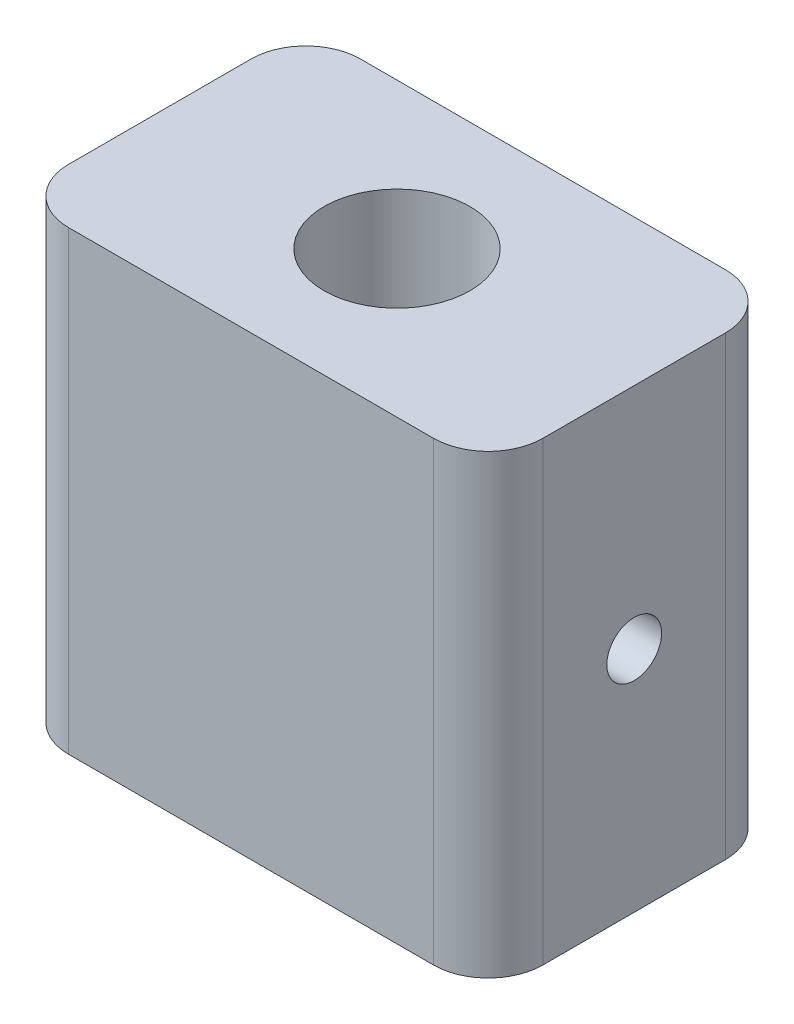
ISO-10303-21;
HEADER;
FILE_DESCRIPTION(('STEP AP214'),'2;1');
FILE_NAME('part.step','',(''),(''),'','','');
FILE_SCHEMA(('AUTOMOTIVE_DESIGN { 1 0 10303 214 1 1 1 1 }'));
ENDSEC;
DATA;
#1=APPLICATION_CONTEXT('core data for automotive mechanical design processes');
#2=APPLICATION_PROTOCOL_DEFINITION('international standard','automotive_design',2000,#1);
#3=PRODUCT_CONTEXT('',#1,'mechanical');
#4=PRODUCT('Part','Part','',(#3));
#5=PRODUCT_RELATED_PRODUCT_CATEGORY('part','',(#4));
#6=PRODUCT_DEFINITION_FORMATION('','',#4);
#7=PRODUCT_DEFINITION_CONTEXT('part definition',#1,'design');
#8=PRODUCT_DEFINITION('design','',#6,#7);
#9=PRODUCT_DEFINITION_SHAPE('','',#8);
#10=(LENGTH_UNIT() NAMED_UNIT(*) SI_UNIT(.MILLI.,.METRE.));
#11=(NAMED_UNIT(*) PLANE_ANGLE_UNIT() SI_UNIT($,.RADIAN.));
#12=(NAMED_UNIT(*) SI_UNIT($,.STERADIAN.) SOLID_ANGLE_UNIT());
#13=UNCERTAINTY_MEASURE_WITH_UNIT(LENGTH_MEASURE(1.E-05),#10,'distance_accuracy_value','');
#14=(GEOMETRIC_REPRESENTATION_CONTEXT(3) GLOBAL_UNCERTAINTY_ASSIGNED_CONTEXT((#13)) GLOBAL_UNIT_ASSIGNED_CONTEXT((#10,
#11,#12)) REPRESENTATION_CONTEXT('',''));
#15=CARTESIAN_POINT('',(0.,0.,0.));
#16=DIRECTION('',(0.,0.,1.));
#17=DIRECTION('',(1.,0.,0.));
#18=AXIS2_PLACEMENT_3D('',#15,#16,#17);
#19=CARTESIAN_POINT('',(-10.,25.,5.));
#20=DIRECTION('',(0.,-1.,0.));
#21=DIRECTION('',(0.,0.,-1.));
#22=AXIS2_PLACEMENT_3D('',#19,#20,#21);
#23=PLANE('',#22);
#24=CARTESIAN_POINT('',(-10.,25.,5.));
#25=DIRECTION('',(0.,1.,0.));
#26=DIRECTION('',(0.,0.,-1.));
#27=AXIS2_PLACEMENT_3D('',#24,#25,#26);
#28=CIRCLE('',#27,3.);
#29=CARTESIAN_POINT('',(-13.,25.,5.));
#30=VERTEX_POINT('',#29);
#31=CARTESIAN_POINT('',(-10.,25.,8.));
#32=VERTEX_POINT('',#31);
#33=EDGE_CURVE('E151',#30,#32,#28,.T.);
#34=ORIENTED_EDGE('',*,*,#33,.T.);
#35=DIRECTION('',(1.,0.,0.));
#36=VECTOR('',#35,1.);
#37=CARTESIAN_POINT('',(10.,25.,8.));
#38=LINE('',#37,#36);
#39=CARTESIAN_POINT('',(10.,25.,8.));
#40=VERTEX_POINT('',#39);
#41=EDGE_CURVE('E99',#32,#40,#38,.T.);
#42=ORIENTED_EDGE('',*,*,#41,.T.);
#43=CARTESIAN_POINT('',(10.,25.,5.));
#44=DIRECTION('',(0.,1.,0.));
#45=DIRECTION('',(0.,0.,1.));
#46=AXIS2_PLACEMENT_3D('',#43,#44,#45);
#47=CIRCLE('',#46,3.);
#48=CARTESIAN_POINT('',(13.,25.,5.));
#49=VERTEX_POINT('',#48);
#50=EDGE_CURVE('E221',#40,#49,#47,.T.);
#51=ORIENTED_EDGE('',*,*,#50,.T.);
#52=DIRECTION('',(0.,0.,-1.));
#53=VECTOR('',#52,1.);
#54=CARTESIAN_POINT('',(13.,25.,5.));
#55=LINE('',#54,#53);
#56=CARTESIAN_POINT('',(13.,25.,-5.));
#57=VERTEX_POINT('',#56);
#58=EDGE_CURVE('E228',#49,#57,#55,.T.);
#59=ORIENTED_EDGE('',*,*,#58,.T.);
#60=CARTESIAN_POINT('',(10.,25.,-5.));
#61=DIRECTION('',(0.,1.,0.));
#62=DIRECTION('',(0.,0.,1.));
#63=AXIS2_PLACEMENT_3D('',#60,#61,#62);
#64=CIRCLE('',#63,3.);
#65=CARTESIAN_POINT('',(10.,25.,-8.));
#66=VERTEX_POINT('',#65);
#67=EDGE_CURVE('E118',#57,#66,#64,.T.);
#68=ORIENTED_EDGE('',*,*,#67,.T.);
#69=DIRECTION('',(-1.,0.,0.));
#70=VECTOR('',#69,1.);
#71=CARTESIAN_POINT('',(10.,25.,-8.));
#72=LINE('',#71,#70);
#73=CARTESIAN_POINT('',(-10.,25.,-8.));
#74=VERTEX_POINT('',#73);
#75=EDGE_CURVE('E112',#66,#74,#72,.T.);
#76=ORIENTED_EDGE('',*,*,#75,.T.);
#77=CARTESIAN_POINT('',(-10.,25.,-5.));
#78=DIRECTION('',(0.,1.,0.));
#79=DIRECTION('',(0.,0.,1.));
#80=AXIS2_PLACEMENT_3D('',#77,#78,#79);
#81=CIRCLE('',#80,3.);
#82=CARTESIAN_POINT('',(-13.,25.,-5.));
#83=VERTEX_POINT('',#82);
#84=EDGE_CURVE('E116',#74,#83,#81,.T.);
#85=ORIENTED_EDGE('',*,*,#84,.T.);
#86=DIRECTION('',(0.,0.,1.));
#87=VECTOR('',#86,1.);
#88=CARTESIAN_POINT('',(-13.,25.,5.));
#89=LINE('',#88,#87);
#90=EDGE_CURVE('E56',#83,#30,#89,.T.);
#91=ORIENTED_EDGE('',*,*,#90,.T.);
#92=EDGE_LOOP('',(#34,#42,#51,#59,#68,#76,#85,#91));
#93=FACE_BOUND('',#92,.T.);
#94=CARTESIAN_POINT('',(0.,25.,0.));
#95=DIRECTION('',(0.,1.,0.));
#96=DIRECTION('',(0.,0.,1.));
#97=AXIS2_PLACEMENT_3D('',#94,#95,#96);
#98=CIRCLE('',#97,4.);
#99=CARTESIAN_POINT('',(0.,25.,4.));
#100=VERTEX_POINT('',#99);
#101=EDGE_CURVE('E140',#100,#100,#98,.T.);
#102=ORIENTED_EDGE('',*,*,#101,.F.);
#103=EDGE_LOOP('',(#102));
#104=FACE_BOUND('',#103,.T.);
#105=ADVANCED_FACE('F33',(#93,#104),#23,.F.);
#106=CARTESIAN_POINT('',(-10.,0.,5.));
#107=DIRECTION('',(0.,-1.,0.));
#108=DIRECTION('',(0.,0.,-1.));
#109=AXIS2_PLACEMENT_3D('',#106,#107,#108);
#110=PLANE('',#109);
#111=CARTESIAN_POINT('',(-10.,0.,5.));
#112=DIRECTION('',(0.,1.,0.));
#113=DIRECTION('',(0.,0.,-1.));
#114=AXIS2_PLACEMENT_3D('',#111,#112,#113);
#115=CIRCLE('',#114,3.);
#116=CARTESIAN_POINT('',(-13.,0.,5.));
#117=VERTEX_POINT('',#116);
#118=CARTESIAN_POINT('',(-10.,0.,8.));
#119=VERTEX_POINT('',#118);
#120=EDGE_CURVE('E136',#117,#119,#115,.T.);
#121=ORIENTED_EDGE('',*,*,#120,.F.);
#122=DIRECTION('',(0.,0.,1.));
#123=VECTOR('',#122,1.);
#124=CARTESIAN_POINT('',(-13.,0.,5.));
#125=LINE('',#124,#123);
#126=CARTESIAN_POINT('',(-13.,0.,-5.));
#127=VERTEX_POINT('',#126);
#128=EDGE_CURVE('E91',#127,#117,#125,.T.);
#129=ORIENTED_EDGE('',*,*,#128,.F.);
#130=CARTESIAN_POINT('',(-10.,0.,-5.));
#131=DIRECTION('',(0.,1.,0.));
#132=DIRECTION('',(0.,0.,1.));
#133=AXIS2_PLACEMENT_3D('',#130,#131,#132);
#134=CIRCLE('',#133,3.);
#135=CARTESIAN_POINT('',(-10.,0.,-8.));
#136=VERTEX_POINT('',#135);
#137=EDGE_CURVE('E85',#136,#127,#134,.T.);
#138=ORIENTED_EDGE('',*,*,#137,.F.);
#139=DIRECTION('',(-1.,0.,0.));
#140=VECTOR('',#139,1.);
#141=CARTESIAN_POINT('',(10.,0.,-8.));
#142=LINE('',#141,#140);
#143=CARTESIAN_POINT('',(10.,0.,-8.));
#144=VERTEX_POINT('',#143);
#145=EDGE_CURVE('E126',#144,#136,#142,.T.);
#146=ORIENTED_EDGE('',*,*,#145,.F.);
#147=CARTESIAN_POINT('',(10.,0.,-5.));
#148=DIRECTION('',(0.,1.,0.));
#149=DIRECTION('',(0.,0.,1.));
#150=AXIS2_PLACEMENT_3D('',#147,#148,#149);
#151=CIRCLE('',#150,3.);
#152=CARTESIAN_POINT('',(13.,0.,-5.));
#153=VERTEX_POINT('',#152);
#154=EDGE_CURVE('E146',#153,#144,#151,.T.);
#155=ORIENTED_EDGE('',*,*,#154,.F.);
#156=DIRECTION('',(0.,0.,-1.));
#157=VECTOR('',#156,1.);
#158=CARTESIAN_POINT('',(13.,0.,5.));
#159=LINE('',#158,#157);
#160=CARTESIAN_POINT('',(13.,0.,5.));
#161=VERTEX_POINT('',#160);
#162=EDGE_CURVE('E144',#161,#153,#159,.T.);
#163=ORIENTED_EDGE('',*,*,#162,.F.);
#164=CARTESIAN_POINT('',(10.,0.,5.));
#165=DIRECTION('',(0.,1.,0.));
#166=DIRECTION('',(0.,0.,1.));
#167=AXIS2_PLACEMENT_3D('',#164,#165,#166);
#168=CIRCLE('',#167,3.);
#169=CARTESIAN_POINT('',(10.,0.,8.));
#170=VERTEX_POINT('',#169);
#171=EDGE_CURVE('E142',#170,#161,#168,.T.);
#172=ORIENTED_EDGE('',*,*,#171,.F.);
#173=DIRECTION('',(1.,0.,0.));
#174=VECTOR('',#173,1.);
#175=CARTESIAN_POINT('',(10.,0.,8.));
#176=LINE('',#175,#174);
#177=EDGE_CURVE('E139',#119,#170,#176,.T.);
#178=ORIENTED_EDGE('',*,*,#177,.F.);
#179=EDGE_LOOP('',(#121,#129,#138,#146,#155,#163,#172,#178));
#180=FACE_BOUND('',#179,.T.);
#181=CARTESIAN_POINT('',(0.,0.,0.));
#182=DIRECTION('',(0.,1.,0.));
#183=DIRECTION('',(0.,0.,1.));
#184=AXIS2_PLACEMENT_3D('',#181,#182,#183);
#185=CIRCLE('',#184,4.);
#186=CARTESIAN_POINT('',(0.,0.,4.));
#187=VERTEX_POINT('',#186);
#188=EDGE_CURVE('E234',#187,#187,#185,.T.);
#189=ORIENTED_EDGE('',*,*,#188,.T.);
#190=EDGE_LOOP('',(#189));
#191=FACE_BOUND('',#190,.T.);
#192=ADVANCED_FACE('F185',(#180,#191),#110,.T.);
#193=CARTESIAN_POINT('',(-10.,25.,5.));
#194=DIRECTION('',(0.,-1.,0.));
#195=DIRECTION('',(0.,0.,-1.));
#196=AXIS2_PLACEMENT_3D('',#193,#194,#195);
#197=CYLINDRICAL_SURFACE('',#196,3.);
#198=ORIENTED_EDGE('',*,*,#120,.T.);
#199=DIRECTION('',(0.,-1.,0.));
#200=VECTOR('',#199,1.);
#201=CARTESIAN_POINT('',(-10.,25.,8.));
#202=LINE('',#201,#200);
#203=EDGE_CURVE('E11',#32,#119,#202,.T.);
#204=ORIENTED_EDGE('',*,*,#203,.F.);
#205=ORIENTED_EDGE('',*,*,#33,.F.);
#206=DIRECTION('',(0.,-1.,0.));
#207=VECTOR('',#206,1.);
#208=CARTESIAN_POINT('',(-13.,25.,5.));
#209=LINE('',#208,#207);
#210=EDGE_CURVE('E132',#30,#117,#209,.T.);
#211=ORIENTED_EDGE('',*,*,#210,.T.);
#212=EDGE_LOOP('',(#198,#204,#205,#211));
#213=FACE_BOUND('',#212,.T.);
#214=ADVANCED_FACE('F35',(#213),#197,.T.);
#215=CARTESIAN_POINT('',(10.,25.,8.));
#216=DIRECTION('',(0.,0.,-1.));
#217=DIRECTION('',(-1.,0.,0.));
#218=AXIS2_PLACEMENT_3D('',#215,#216,#217);
#219=PLANE('',#218);
#220=ORIENTED_EDGE('',*,*,#177,.T.);
#221=DIRECTION('',(0.,-1.,0.));
#222=VECTOR('',#221,1.);
#223=CARTESIAN_POINT('',(10.,25.,8.));
#224=LINE('',#223,#222);
#225=EDGE_CURVE('E47',#40,#170,#224,.T.);
#226=ORIENTED_EDGE('',*,*,#225,.F.);
#227=ORIENTED_EDGE('',*,*,#41,.F.);
#228=ORIENTED_EDGE('',*,*,#203,.T.);
#229=EDGE_LOOP('',(#220,#226,#227,#228));
#230=FACE_BOUND('',#229,.T.);
#231=ADVANCED_FACE('F209',(#230),#219,.F.);
#232=CARTESIAN_POINT('',(10.,25.,5.));
#233=DIRECTION('',(0.,-1.,0.));
#234=DIRECTION('',(0.,0.,-1.));
#235=AXIS2_PLACEMENT_3D('',#232,#233,#234);
#236=CYLINDRICAL_SURFACE('',#235,3.);
#237=ORIENTED_EDGE('',*,*,#171,.T.);
#238=DIRECTION('',(0.,-1.,0.));
#239=VECTOR('',#238,1.);
#240=CARTESIAN_POINT('',(13.,25.,5.));
#241=LINE('',#240,#239);
#242=EDGE_CURVE('E158',#49,#161,#241,.T.);
#243=ORIENTED_EDGE('',*,*,#242,.F.);
#244=ORIENTED_EDGE('',*,*,#50,.F.);
#245=ORIENTED_EDGE('',*,*,#225,.T.);
#246=EDGE_LOOP('',(#237,#243,#244,#245));
#247=FACE_BOUND('',#246,.T.);
#248=ADVANCED_FACE('F206',(#247),#236,.T.);
#249=CARTESIAN_POINT('',(13.,25.,5.));
#250=DIRECTION('',(-1.,0.,0.));
#251=DIRECTION('',(0.,0.,1.));
#252=AXIS2_PLACEMENT_3D('',#249,#250,#251);
#253=PLANE('',#252);
#254=CARTESIAN_POINT('',(13.,12.5,0.));
#255=DIRECTION('',(1.,0.,0.));
#256=DIRECTION('',(0.,0.,-1.));
#257=AXIS2_PLACEMENT_3D('',#254,#255,#256);
#258=CIRCLE('',#257,1.5);
#259=CARTESIAN_POINT('',(13.,12.5,-1.5));
#260=VERTEX_POINT('',#259);
#261=EDGE_CURVE('E166',#260,#260,#258,.T.);
#262=ORIENTED_EDGE('',*,*,#261,.F.);
#263=EDGE_LOOP('',(#262));
#264=FACE_BOUND('',#263,.T.);
#265=ORIENTED_EDGE('',*,*,#162,.T.);
#266=DIRECTION('',(0.,-1.,0.));
#267=VECTOR('',#266,1.);
#268=CARTESIAN_POINT('',(13.,25.,-5.));
#269=LINE('',#268,#267);
#270=EDGE_CURVE('E155',#57,#153,#269,.T.);
#271=ORIENTED_EDGE('',*,*,#270,.F.);
#272=ORIENTED_EDGE('',*,*,#58,.F.);
#273=ORIENTED_EDGE('',*,*,#242,.T.);
#274=EDGE_LOOP('',(#265,#271,#272,#273));
#275=FACE_BOUND('',#274,.T.);
#276=ADVANCED_FACE('F202',(#264,#275),#253,.F.);
#277=CARTESIAN_POINT('',(10.,25.,-5.));
#278=DIRECTION('',(0.,-1.,0.));
#279=DIRECTION('',(0.,0.,-1.));
#280=AXIS2_PLACEMENT_3D('',#277,#278,#279);
#281=CYLINDRICAL_SURFACE('',#280,3.);
#282=ORIENTED_EDGE('',*,*,#154,.T.);
#283=DIRECTION('',(0.,-1.,0.));
#284=VECTOR('',#283,1.);
#285=CARTESIAN_POINT('',(10.,25.,-8.));
#286=LINE('',#285,#284);
#287=EDGE_CURVE('E127',#66,#144,#286,.T.);
#288=ORIENTED_EDGE('',*,*,#287,.F.);
#289=ORIENTED_EDGE('',*,*,#67,.F.);
#290=ORIENTED_EDGE('',*,*,#270,.T.);
#291=EDGE_LOOP('',(#282,#288,#289,#290));
#292=FACE_BOUND('',#291,.T.);
#293=ADVANCED_FACE('F199',(#292),#281,.T.);
#294=CARTESIAN_POINT('',(10.,25.,-8.));
#295=DIRECTION('',(0.,0.,1.));
#296=DIRECTION('',(1.,0.,0.));
#297=AXIS2_PLACEMENT_3D('',#294,#295,#296);
#298=PLANE('',#297);
#299=ORIENTED_EDGE('',*,*,#145,.T.);
#300=DIRECTION('',(0.,-1.,0.));
#301=VECTOR('',#300,1.);
#302=CARTESIAN_POINT('',(-10.,25.,-8.));
#303=LINE('',#302,#301);
#304=EDGE_CURVE('E123',#74,#136,#303,.T.);
#305=ORIENTED_EDGE('',*,*,#304,.F.);
#306=ORIENTED_EDGE('',*,*,#75,.F.);
#307=ORIENTED_EDGE('',*,*,#287,.T.);
#308=EDGE_LOOP('',(#299,#305,#306,#307));
#309=FACE_BOUND('',#308,.T.);
#310=ADVANCED_FACE('F124',(#309),#298,.F.);
#311=CARTESIAN_POINT('',(-10.,25.,-5.));
#312=DIRECTION('',(0.,-1.,0.));
#313=DIRECTION('',(0.,0.,-1.));
#314=AXIS2_PLACEMENT_3D('',#311,#312,#313);
#315=CYLINDRICAL_SURFACE('',#314,3.);
#316=ORIENTED_EDGE('',*,*,#137,.T.);
#317=DIRECTION('',(0.,-1.,0.));
#318=VECTOR('',#317,1.);
#319=CARTESIAN_POINT('',(-13.,25.,-5.));
#320=LINE('',#319,#318);
#321=EDGE_CURVE('E128',#83,#127,#320,.T.);
#322=ORIENTED_EDGE('',*,*,#321,.F.);
#323=ORIENTED_EDGE('',*,*,#84,.F.);
#324=ORIENTED_EDGE('',*,*,#304,.T.);
#325=EDGE_LOOP('',(#316,#322,#323,#324));
#326=FACE_BOUND('',#325,.T.);
#327=ADVANCED_FACE('F130',(#326),#315,.T.);
#328=CARTESIAN_POINT('',(-13.,25.,5.));
#329=DIRECTION('',(1.,0.,0.));
#330=DIRECTION('',(0.,0.,-1.));
#331=AXIS2_PLACEMENT_3D('',#328,#329,#330);
#332=PLANE('',#331);
#333=CARTESIAN_POINT('',(-13.,12.5,0.));
#334=DIRECTION('',(1.,0.,0.));
#335=DIRECTION('',(0.,0.,-1.));
#336=AXIS2_PLACEMENT_3D('',#333,#334,#335);
#337=CIRCLE('',#336,1.5);
#338=CARTESIAN_POINT('',(-13.,12.5,-1.5));
#339=VERTEX_POINT('',#338);
#340=EDGE_CURVE('E237',#339,#339,#337,.T.);
#341=ORIENTED_EDGE('',*,*,#340,.T.);
#342=EDGE_LOOP('',(#341));
#343=FACE_BOUND('',#342,.T.);
#344=ORIENTED_EDGE('',*,*,#128,.T.);
#345=ORIENTED_EDGE('',*,*,#210,.F.);
#346=ORIENTED_EDGE('',*,*,#90,.F.);
#347=ORIENTED_EDGE('',*,*,#321,.T.);
#348=EDGE_LOOP('',(#344,#345,#346,#347));
#349=FACE_BOUND('',#348,.T.);
#350=ADVANCED_FACE('F181',(#343,#349),#332,.F.);
#351=CARTESIAN_POINT('',(0.,25.,0.));
#352=DIRECTION('',(0.,-1.,0.));
#353=DIRECTION('',(0.,0.,-1.));
#354=AXIS2_PLACEMENT_3D('',#351,#352,#353);
#355=CYLINDRICAL_SURFACE('',#354,4.);
#356=CARTESIAN_POINT('',(-3.70809924354783,12.5,-1.5));
#357=CARTESIAN_POINT('',(-3.70809640633806,12.5810074837208,-1.50000304106109));
#358=CARTESIAN_POINT('',(-3.71078260240986,12.6619949225036,-1.49341597549487));
#359=CARTESIAN_POINT('',(-3.72116159304967,12.8215280829132,-1.46736187895468));
#360=CARTESIAN_POINT('',(-3.72885423767112,12.900073877595,-1.44789523373263));
#361=CARTESIAN_POINT('',(-3.748254802809,13.0523753716135,-1.39689657610574));
#362=CARTESIAN_POINT('',(-3.7599530956926,13.1261420566511,-1.36539347266348));
#363=CARTESIAN_POINT('',(-3.78603134206598,13.2673718968188,-1.29131856742697));
#364=CARTESIAN_POINT('',(-3.80041210067323,13.3348331502825,-1.24874344095039));
#365=CARTESIAN_POINT('',(-3.83103574665713,13.4648903116228,-1.15146661374162));
#366=CARTESIAN_POINT('',(-3.84733341923603,13.5271285296294,-1.09630381213306));
#367=CARTESIAN_POINT('',(-3.87949750628547,13.6417228146715,-0.976395839778925));
#368=CARTESIAN_POINT('',(-3.89536382814785,13.6940767737419,-0.911648630256678));
#369=CARTESIAN_POINT('',(-3.92552873936553,13.7891395122956,-0.771694655177598));
#370=CARTESIAN_POINT('',(-3.93975561223505,13.8314594747159,-0.696206947538026));
#371=CARTESIAN_POINT('',(-3.96438007973848,13.9026511725249,-0.538555771965246));
#372=CARTESIAN_POINT('',(-3.97477900217006,13.931527571992,-0.456394630933535));
#373=CARTESIAN_POINT('',(-3.9901869710344,13.9737578957746,-0.291489341676831));
#374=CARTESIAN_POINT('',(-3.99540915214774,13.9877276274405,-0.208923197281596));
#375=CARTESIAN_POINT('',(-4.0006401410794,14.001721200945,-0.0424643637947856));
#376=CARTESIAN_POINT('',(-4.00065064414902,14.0017495776187,0.0414278850628336));
#377=CARTESIAN_POINT('',(-3.99559265903894,13.9882182385348,0.203743543064477));
#378=CARTESIAN_POINT('',(-3.99077541996683,13.9753307020512,0.282232178266901));
#379=CARTESIAN_POINT('',(-3.97693274932263,13.9374640847744,0.435839217984392));
#380=CARTESIAN_POINT('',(-3.96790701975577,13.912484147738,0.510957383430299));
#381=CARTESIAN_POINT('',(-3.9463776916753,13.8508295483242,0.656989017303105));
#382=CARTESIAN_POINT('',(-3.93382539470077,13.8139899947316,0.72782539228731));
#383=CARTESIAN_POINT('',(-3.90651310225279,13.7298079030706,0.86248660795756));
#384=CARTESIAN_POINT('',(-3.8917523951284,13.6824619769824,0.926309176932323));
#385=CARTESIAN_POINT('',(-3.86052529655816,13.5753727137168,1.04909048680094));
#386=CARTESIAN_POINT('',(-3.84400963763883,13.5150660843496,1.10754614526348));
#387=CARTESIAN_POINT('',(-3.81182460645722,13.3854070066784,1.21370395569342));
#388=CARTESIAN_POINT('',(-3.79615544748847,13.3160522934134,1.261403406929));
#389=CARTESIAN_POINT('',(-3.76712703500335,13.1682805325372,1.34565611808152));
#390=CARTESIAN_POINT('',(-3.75382677150277,13.0896965063139,1.38193847851831));
#391=CARTESIAN_POINT('',(-3.73172438629002,12.9269037748324,1.44056464441501));
#392=CARTESIAN_POINT('',(-3.72291976205783,12.8426982284063,1.46291620605595));
#393=CARTESIAN_POINT('',(-3.71139597222848,12.676024037684,1.49190191709668));
#394=CARTESIAN_POINT('',(-3.70836785241537,12.5937158944639,1.49933521158966));
#395=CARTESIAN_POINT('',(-3.70786539525016,12.4289906432583,1.50057885636272));
#396=CARTESIAN_POINT('',(-3.71038967003987,12.3465735676475,1.49439261093762));
#397=CARTESIAN_POINT('',(-3.72039381629735,12.1880700777123,1.46929733520157));
#398=CARTESIAN_POINT('',(-3.72763276216449,12.1118688642353,1.45100618334225));
#399=CARTESIAN_POINT('',(-3.74596487046362,11.9636520552798,1.40299774640638));
#400=CARTESIAN_POINT('',(-3.75705882250173,11.8916373208319,1.37327812034623));
#401=CARTESIAN_POINT('',(-3.7823624311608,11.7508355619238,1.30200292275278));
#402=CARTESIAN_POINT('',(-3.79667328892065,11.6822707078627,1.26004545177047));
#403=CARTESIAN_POINT('',(-3.82662814294291,11.552871018274,1.16591317862479));
#404=CARTESIAN_POINT('',(-3.84227262594077,11.4920390253754,1.11373463696435));
#405=CARTESIAN_POINT('',(-3.87433046553184,11.3758316268049,0.996727340900939));
#406=CARTESIAN_POINT('',(-3.89072969357028,11.3210465912312,0.931306341491062));
#407=CARTESIAN_POINT('',(-3.92149874963302,11.2231616324106,0.791797471753151));
#408=CARTESIAN_POINT('',(-3.93586857107664,11.1800617470542,0.717709573322674));
#409=CARTESIAN_POINT('',(-3.96094985704552,11.1070539438004,0.563016329468477));
#410=CARTESIAN_POINT('',(-3.9716738133801,11.0771008762074,0.482434433064627));
#411=CARTESIAN_POINT('',(-3.98829436712571,11.0313435861501,0.316881887523255));
#412=CARTESIAN_POINT('',(-3.99419323299412,11.0155327145776,0.231913320723593));
#413=CARTESIAN_POINT('',(-4.00028407317073,10.9992255972452,0.0653355852738161));
#414=CARTESIAN_POINT('',(-4.00078860953764,10.997890516941,-0.0161807680608446));
#415=CARTESIAN_POINT('',(-3.99684889809224,11.0084151594454,-0.178226786412423));
#416=CARTESIAN_POINT('',(-3.9924052471313,11.0202732908859,-0.258756569245257));
#417=CARTESIAN_POINT('',(-3.97921089603771,11.0562588514936,-0.414548248377125));
#418=CARTESIAN_POINT('',(-3.97056791378017,11.0800799058784,-0.489890731068834));
#419=CARTESIAN_POINT('',(-3.9498778362099,11.1390100133844,-0.635515473006389));
#420=CARTESIAN_POINT('',(-3.93783009655664,11.1741212033048,-0.705796771275542));
#421=CARTESIAN_POINT('',(-3.91090618300074,11.2563139435048,-0.842540176994412));
#422=CARTESIAN_POINT('',(-3.89593240108828,11.3038366405141,-0.908717548846849));
#423=CARTESIAN_POINT('',(-3.86499507694844,11.4088078301876,-1.03241734752336));
#424=CARTESIAN_POINT('',(-3.84903118274027,11.4662598658079,-1.0899366712559));
#425=CARTESIAN_POINT('',(-3.81688129739175,11.5930641316451,-1.19781214236196));
#426=CARTESIAN_POINT('',(-3.8007280534916,11.6628844021543,-1.24762999816025));
#427=CARTESIAN_POINT('',(-3.77098325003638,11.8104158695733,-1.33484709556843));
#428=CARTESIAN_POINT('',(-3.75739195631216,11.8881278840535,-1.37224504878157));
#429=CARTESIAN_POINT('',(-3.73402269853266,12.0529556809754,-1.4346588697426));
#430=CARTESIAN_POINT('',(-3.7244380329086,12.1403343665118,-1.45906002899523));
#431=CARTESIAN_POINT('',(-3.71147994336315,12.3184852719558,-1.49172356722079));
#432=CARTESIAN_POINT('',(-3.70810242179736,12.40925521271,-1.4999965933957));
#433=CARTESIAN_POINT('',(-3.70809924354783,12.5,-1.5));
#434=B_SPLINE_CURVE_WITH_KNOTS('',3,(#356,#357,#358,#359,#360,#361,#362,#363,#364,#365,#366,
#367,#368,#369,#370,#371,#372,#373,#374,#375,#376,#377,#378,#379,#380,#381,#382,#383,#384,#385,
#386,#387,#388,#389,#390,#391,#392,#393,#394,#395,#396,#397,#398,#399,#400,#401,#402,#403,#404,
#405,#406,#407,#408,#409,#410,#411,#412,#413,#414,#415,#416,#417,#418,#419,#420,#421,#422,#423,
#424,#425,#426,#427,#428,#429,#430,#431,#432,#433),.UNSPECIFIED.,.T.,.F.,(4,2,2,2,2,2,2,2,2,2,2,
2,2,2,2,2,2,2,2,2,2,2,2,2,2,2,2,2,2,2,2,2,2,2,2,2,2,2,4),(0.,0.242684541416169,
0.485361814598854,0.727459856757029,0.969630679682933,1.22274652401128,1.47591628822983,
1.73770072136421,1.9993942638133,2.24980018489679,2.50012465404857,2.73806472803194,
2.97602165263335,3.21744131210668,3.45893893628976,3.71456675065874,3.97025867827335,
4.23162592252966,4.49284751635474,4.73965657740485,4.98640395388884,5.22143845928199,
5.45652113429526,5.70041561005821,5.94439948466355,6.20385016993624,6.46330169650178,
6.72185508890168,6.98028685560127,7.22365720549936,7.46699820319479,7.7044027400389,
7.94185223512831,8.18928323676987,8.43680270894964,8.69738599542079,8.95799630544242,
9.23003178870926,9.50188762323053),.UNSPECIFIED.);
#435=CARTESIAN_POINT('',(-3.70809924354783,12.5,-1.5));
#436=VERTEX_POINT('',#435);
#437=EDGE_CURVE('E37',#436,#436,#434,.T.);
#438=ORIENTED_EDGE('',*,*,#437,.F.);
#439=EDGE_LOOP('',(#438));
#440=FACE_BOUND('',#439,.T.);
#441=CARTESIAN_POINT('',(3.70809924354783,12.5,-1.5));
#442=CARTESIAN_POINT('',(3.70809640633806,12.4189925162792,-1.50000304106109));
#443=CARTESIAN_POINT('',(3.71078260240986,12.3380050774964,-1.49341597549487));
#444=CARTESIAN_POINT('',(3.72116159304967,12.1784719170868,-1.46736187895468));
#445=CARTESIAN_POINT('',(3.72885423767112,12.099926122405,-1.44789523373263));
#446=CARTESIAN_POINT('',(3.748254802809,11.9476246283865,-1.39689657610574));
#447=CARTESIAN_POINT('',(3.7599530956926,11.8738579433489,-1.36539347266348));
#448=CARTESIAN_POINT('',(3.78603134206598,11.7326281031812,-1.29131856742697));
#449=CARTESIAN_POINT('',(3.80041210067323,11.6651668497175,-1.24874344095039));
#450=CARTESIAN_POINT('',(3.83103574665713,11.5351096883772,-1.15146661374162));
#451=CARTESIAN_POINT('',(3.84733341923603,11.4728714703706,-1.09630381213306));
#452=CARTESIAN_POINT('',(3.87949750628547,11.3582771853285,-0.976395839778925));
#453=CARTESIAN_POINT('',(3.89536382814785,11.3059232262581,-0.911648630256678));
#454=CARTESIAN_POINT('',(3.92552873936553,11.2108604877044,-0.771694655177598));
#455=CARTESIAN_POINT('',(3.93975561223505,11.1685405252841,-0.696206947538026));
#456=CARTESIAN_POINT('',(3.96438007973848,11.0973488274751,-0.538555771965246));
#457=CARTESIAN_POINT('',(3.97477900217006,11.068472428008,-0.456394630933535));
#458=CARTESIAN_POINT('',(3.9901869710344,11.0262421042254,-0.291489341676831));
#459=CARTESIAN_POINT('',(3.99540915214774,11.0122723725595,-0.208923197281596));
#460=CARTESIAN_POINT('',(4.0006401410794,10.998278799055,-0.0424643637947856));
#461=CARTESIAN_POINT('',(4.00065064414902,10.9982504223813,0.0414278850628336));
#462=CARTESIAN_POINT('',(3.99559265903894,11.0117817614652,0.203743543064477));
#463=CARTESIAN_POINT('',(3.99077541996683,11.0246692979488,0.282232178266901));
#464=CARTESIAN_POINT('',(3.97693274932263,11.0625359152256,0.435839217984392));
#465=CARTESIAN_POINT('',(3.96790701975577,11.087515852262,0.510957383430299));
#466=CARTESIAN_POINT('',(3.9463776916753,11.1491704516758,0.656989017303105));
#467=CARTESIAN_POINT('',(3.93382539470077,11.1860100052684,0.72782539228731));
#468=CARTESIAN_POINT('',(3.90651310225279,11.2701920969294,0.86248660795756));
#469=CARTESIAN_POINT('',(3.8917523951284,11.3175380230176,0.926309176932323));
#470=CARTESIAN_POINT('',(3.86052529655816,11.4246272862832,1.04909048680094));
#471=CARTESIAN_POINT('',(3.84400963763883,11.4849339156504,1.10754614526348));
#472=CARTESIAN_POINT('',(3.81182460645722,11.6145929933216,1.21370395569342));
#473=CARTESIAN_POINT('',(3.79615544748847,11.6839477065866,1.261403406929));
#474=CARTESIAN_POINT('',(3.76712703500335,11.8317194674628,1.34565611808152));
#475=CARTESIAN_POINT('',(3.75382677150277,11.9103034936861,1.38193847851831));
#476=CARTESIAN_POINT('',(3.73172438629002,12.0730962251676,1.44056464441501));
#477=CARTESIAN_POINT('',(3.72291976205783,12.1573017715937,1.46291620605595));
#478=CARTESIAN_POINT('',(3.71139597222848,12.323975962316,1.49190191709668));
#479=CARTESIAN_POINT('',(3.70836785241537,12.4062841055361,1.49933521158966));
#480=CARTESIAN_POINT('',(3.70786539525016,12.5710093567417,1.50057885636272));
#481=CARTESIAN_POINT('',(3.71038967003987,12.6534264323525,1.49439261093762));
#482=CARTESIAN_POINT('',(3.72039381629735,12.8119299222877,1.46929733520157));
#483=CARTESIAN_POINT('',(3.72763276216449,12.8881311357647,1.45100618334225));
#484=CARTESIAN_POINT('',(3.74596487046362,13.0363479447202,1.40299774640638));
#485=CARTESIAN_POINT('',(3.75705882250173,13.1083626791681,1.37327812034623));
#486=CARTESIAN_POINT('',(3.7823624311608,13.2491644380762,1.30200292275278));
#487=CARTESIAN_POINT('',(3.79667328892065,13.3177292921373,1.26004545177047));
#488=CARTESIAN_POINT('',(3.82662814294291,13.447128981726,1.16591317862479));
#489=CARTESIAN_POINT('',(3.84227262594077,13.5079609746246,1.11373463696435));
#490=CARTESIAN_POINT('',(3.87433046553184,13.6241683731951,0.996727340900939));
#491=CARTESIAN_POINT('',(3.89072969357028,13.6789534087688,0.931306341491062));
#492=CARTESIAN_POINT('',(3.92149874963302,13.7768383675894,0.791797471753151));
#493=CARTESIAN_POINT('',(3.93586857107664,13.8199382529458,0.717709573322674));
#494=CARTESIAN_POINT('',(3.96094985704552,13.8929460561996,0.563016329468477));
#495=CARTESIAN_POINT('',(3.9716738133801,13.9228991237926,0.482434433064627));
#496=CARTESIAN_POINT('',(3.98829436712571,13.9686564138499,0.316881887523255));
#497=CARTESIAN_POINT('',(3.99419323299412,13.9844672854224,0.231913320723593));
#498=CARTESIAN_POINT('',(4.00028407317073,14.0007744027548,0.0653355852738161));
#499=CARTESIAN_POINT('',(4.00078860953764,14.002109483059,-0.0161807680608446));
#500=CARTESIAN_POINT('',(3.99684889809224,13.9915848405546,-0.178226786412423));
#501=CARTESIAN_POINT('',(3.9924052471313,13.9797267091141,-0.258756569245256));
#502=CARTESIAN_POINT('',(3.97921089603771,13.9437411485064,-0.414548248377126));
#503=CARTESIAN_POINT('',(3.97056791378017,13.9199200941216,-0.489890731068834));
#504=CARTESIAN_POINT('',(3.9498778362099,13.8609899866156,-0.63551547300639));
#505=CARTESIAN_POINT('',(3.93783009655664,13.8258787966952,-0.705796771275542));
#506=CARTESIAN_POINT('',(3.91090618300074,13.7436860564952,-0.842540176994412));
#507=CARTESIAN_POINT('',(3.89593240108828,13.6961633594859,-0.908717548846849));
#508=CARTESIAN_POINT('',(3.86499507694844,13.5911921698124,-1.03241734752336));
#509=CARTESIAN_POINT('',(3.84903118274027,13.5337401341921,-1.0899366712559));
#510=CARTESIAN_POINT('',(3.81688129739175,13.4069358683549,-1.19781214236196));
#511=CARTESIAN_POINT('',(3.8007280534916,13.3371155978457,-1.24762999816025));
#512=CARTESIAN_POINT('',(3.77098325003638,13.1895841304267,-1.33484709556843));
#513=CARTESIAN_POINT('',(3.75739195631216,13.1118721159465,-1.37224504878157));
#514=CARTESIAN_POINT('',(3.73402269853266,12.9470443190246,-1.4346588697426));
#515=CARTESIAN_POINT('',(3.7244380329086,12.8596656334882,-1.45906002899523));
#516=CARTESIAN_POINT('',(3.71147994336315,12.6815147280442,-1.49172356722079));
#517=CARTESIAN_POINT('',(3.70810242179736,12.59074478729,-1.4999965933957));
#518=CARTESIAN_POINT('',(3.70809924354783,12.5,-1.5));
#519=B_SPLINE_CURVE_WITH_KNOTS('',3,(#441,#442,#443,#444,#445,#446,#447,#448,#449,#450,#451,
#452,#453,#454,#455,#456,#457,#458,#459,#460,#461,#462,#463,#464,#465,#466,#467,#468,#469,#470,
#471,#472,#473,#474,#475,#476,#477,#478,#479,#480,#481,#482,#483,#484,#485,#486,#487,#488,#489,
#490,#491,#492,#493,#494,#495,#496,#497,#498,#499,#500,#501,#502,#503,#504,#505,#506,#507,#508,
#509,#510,#511,#512,#513,#514,#515,#516,#517,#518),.UNSPECIFIED.,.T.,.F.,(4,2,2,2,2,2,2,2,2,2,2,
2,2,2,2,2,2,2,2,2,2,2,2,2,2,2,2,2,2,2,2,2,2,2,2,2,2,2,4),(0.,0.242684541416169,
0.485361814598854,0.727459856757029,0.969630679682933,1.22274652401128,1.47591628822983,
1.73770072136421,1.9993942638133,2.24980018489679,2.50012465404857,2.73806472803194,
2.97602165263335,3.21744131210668,3.45893893628976,3.71456675065874,3.97025867827335,
4.23162592252966,4.49284751635474,4.73965657740485,4.98640395388884,5.22143845928199,
5.45652113429526,5.70041561005821,5.94439948466355,6.20385016993624,6.46330169650178,
6.72185508890168,6.98028685560127,7.22365720549936,7.4669982031948,7.7044027400389,
7.94185223512831,8.18928323676987,8.43680270894964,8.69738599542079,8.95799630544242,
9.23003178870926,9.50188762323053),.UNSPECIFIED.);
#520=CARTESIAN_POINT('',(3.70809924354783,12.5,-1.5));
#521=VERTEX_POINT('',#520);
#522=EDGE_CURVE('E162',#521,#521,#519,.T.);
#523=ORIENTED_EDGE('',*,*,#522,.F.);
#524=EDGE_LOOP('',(#523));
#525=FACE_BOUND('',#524,.T.);
#526=ORIENTED_EDGE('',*,*,#101,.T.);
#527=EDGE_LOOP('',(#526));
#528=FACE_BOUND('',#527,.T.);
#529=ORIENTED_EDGE('',*,*,#188,.F.);
#530=EDGE_LOOP('',(#529));
#531=FACE_BOUND('',#530,.T.);
#532=ADVANCED_FACE('F167',(#440,#525,#528,#531),#355,.F.);
#533=CARTESIAN_POINT('',(-33.,12.5,0.));
#534=DIRECTION('',(1.,0.,0.));
#535=DIRECTION('',(0.,0.,-1.));
#536=AXIS2_PLACEMENT_3D('',#533,#534,#535);
#537=CYLINDRICAL_SURFACE('',#536,1.5);
#538=ORIENTED_EDGE('',*,*,#522,.T.);
#539=EDGE_LOOP('',(#538));
#540=FACE_BOUND('',#539,.T.);
#541=ORIENTED_EDGE('',*,*,#261,.T.);
#542=EDGE_LOOP('',(#541));
#543=FACE_BOUND('',#542,.T.);
#544=ADVANCED_FACE('F170',(#540,#543),#537,.F.);
#545=ORIENTED_EDGE('',*,*,#437,.T.);
#546=EDGE_LOOP('',(#545));
#547=FACE_BOUND('',#546,.T.);
#548=ORIENTED_EDGE('',*,*,#340,.F.);
#549=EDGE_LOOP('',(#548));
#550=FACE_BOUND('',#549,.T.);
#551=ADVANCED_FACE('F173',(#547,#550),#537,.F.);
#552=CLOSED_SHELL('',(#105,#192,#214,#231,#248,#276,#293,#310,#327,#350,#532,#544,#551));
#553=MANIFOLD_SOLID_BREP('B2',#552);
#554=ADVANCED_BREP_SHAPE_REPRESENTATION('',(#18,#553),#14);
#555=SHAPE_DEFINITION_REPRESENTATION(#9,#554);
ENDSEC;
END-ISO-10303-21;
